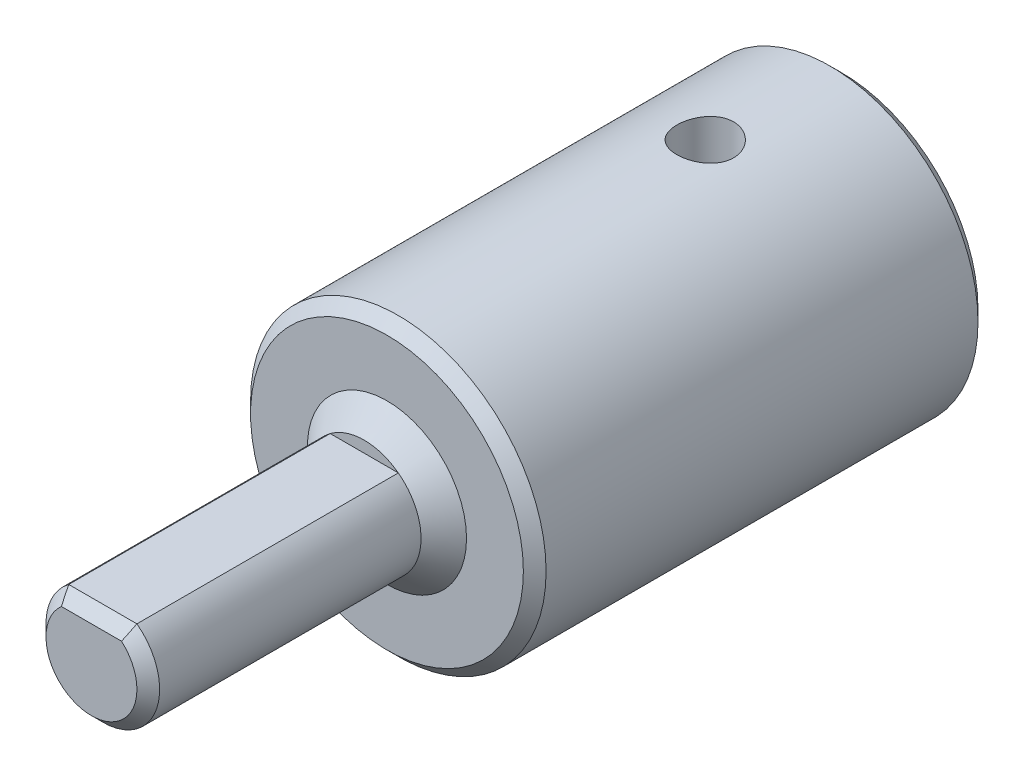
ISO-10303-21;
HEADER;
FILE_DESCRIPTION(('STEP AP214'),'2;1');
FILE_NAME('part.step','',(''),(''),'','','');
FILE_SCHEMA(('AUTOMOTIVE_DESIGN { 1 0 10303 214 1 1 1 1 }'));
ENDSEC;
DATA;
#1=APPLICATION_CONTEXT('core data for automotive mechanical design processes');
#2=APPLICATION_PROTOCOL_DEFINITION('international standard','automotive_design',2000,#1);
#3=PRODUCT_CONTEXT('',#1,'mechanical');
#4=PRODUCT('Part','Part','',(#3));
#5=PRODUCT_RELATED_PRODUCT_CATEGORY('part','',(#4));
#6=PRODUCT_DEFINITION_FORMATION('','',#4);
#7=PRODUCT_DEFINITION_CONTEXT('part definition',#1,'design');
#8=PRODUCT_DEFINITION('design','',#6,#7);
#9=PRODUCT_DEFINITION_SHAPE('','',#8);
#10=(LENGTH_UNIT() NAMED_UNIT(*) SI_UNIT(.MILLI.,.METRE.));
#11=(NAMED_UNIT(*) PLANE_ANGLE_UNIT() SI_UNIT($,.RADIAN.));
#12=(NAMED_UNIT(*) SI_UNIT($,.STERADIAN.) SOLID_ANGLE_UNIT());
#13=UNCERTAINTY_MEASURE_WITH_UNIT(LENGTH_MEASURE(1.E-05),#10,'distance_accuracy_value','');
#14=(GEOMETRIC_REPRESENTATION_CONTEXT(3) GLOBAL_UNCERTAINTY_ASSIGNED_CONTEXT((#13)) GLOBAL_UNIT_ASSIGNED_CONTEXT((#10,
#11,#12)) REPRESENTATION_CONTEXT('',''));
#15=CARTESIAN_POINT('',(0.,0.,0.));
#16=DIRECTION('',(0.,0.,1.));
#17=DIRECTION('',(1.,0.,0.));
#18=AXIS2_PLACEMENT_3D('',#15,#16,#17);
#19=CARTESIAN_POINT('',(0.,0.,20.));
#20=DIRECTION('',(0.,0.,-1.));
#21=DIRECTION('',(-1.,0.,0.));
#22=AXIS2_PLACEMENT_3D('',#19,#20,#21);
#23=CYLINDRICAL_SURFACE('',#22,6.5);
#24=CARTESIAN_POINT('',(0.,0.,0.500000000000011));
#25=DIRECTION('',(0.,0.,1.));
#26=DIRECTION('',(1.,0.,0.));
#27=AXIS2_PLACEMENT_3D('',#24,#25,#26);
#28=CIRCLE('',#27,6.5);
#29=CARTESIAN_POINT('',(6.5,0.,0.500000000000011));
#30=VERTEX_POINT('',#29);
#31=EDGE_CURVE('E48',#30,#30,#28,.T.);
#32=ORIENTED_EDGE('',*,*,#31,.T.);
#33=EDGE_LOOP('',(#32));
#34=FACE_BOUND('',#33,.T.);
#35=CARTESIAN_POINT('',(0.,0.,19.5));
#36=DIRECTION('',(0.,0.,1.));
#37=DIRECTION('',(1.,0.,0.));
#38=AXIS2_PLACEMENT_3D('',#35,#36,#37);
#39=CIRCLE('',#38,6.5);
#40=CARTESIAN_POINT('',(6.5,0.,19.5));
#41=VERTEX_POINT('',#40);
#42=EDGE_CURVE('E266',#41,#41,#39,.F.);
#43=ORIENTED_EDGE('',*,*,#42,.T.);
#44=EDGE_LOOP('',(#43));
#45=FACE_BOUND('',#44,.T.);
#46=CARTESIAN_POINT('',(0.,6.5,4.75));
#47=CARTESIAN_POINT('',(-0.0695263300903769,6.49999873054918,4.75000262060985));
#48=CARTESIAN_POINT('',(-0.139086386536078,6.49887299034978,4.755820293649));
#49=CARTESIAN_POINT('',(-0.27624406654568,6.49449072478032,4.77892097243111));
#50=CARTESIAN_POINT('',(-0.3438400224473,6.49123244093525,4.79621344034301));
#51=CARTESIAN_POINT('',(-0.475066268731186,6.48294932466697,4.84171279024407));
#52=CARTESIAN_POINT('',(-0.538700159856868,6.47792612463065,4.86990958913682));
#53=CARTESIAN_POINT('',(-0.660328619211793,6.46666077439192,4.93638806396313));
#54=CARTESIAN_POINT('',(-0.718323597744222,6.46041871297687,4.97466900539309));
#55=CARTESIAN_POINT('',(-0.82776216487111,6.44731615012176,5.06073958285389));
#56=CARTESIAN_POINT('',(-0.87912464768377,6.44044947743084,5.10863141572555));
#57=CARTESIAN_POINT('',(-0.973138343078083,6.42691706808667,5.21234451859733));
#58=CARTESIAN_POINT('',(-1.01578890972676,6.42025134636388,5.26816637603829));
#59=CARTESIAN_POINT('',(-1.09150839810311,6.4078154700976,5.3867319976789));
#60=CARTESIAN_POINT('',(-1.12449425725113,6.40205326632547,5.44952971555017));
#61=CARTESIAN_POINT('',(-1.17941610157594,6.39216406280365,5.57990495501328));
#62=CARTESIAN_POINT('',(-1.20135309167639,6.38803691434868,5.64748204127121));
#63=CARTESIAN_POINT('',(-1.23329305228569,6.38194735063818,5.78462809585959));
#64=CARTESIAN_POINT('',(-1.24343779395771,6.37995924110286,5.85416288334854));
#65=CARTESIAN_POINT('',(-1.2519454509238,6.37829543879724,5.99397381845999));
#66=CARTESIAN_POINT('',(-1.25030947843596,6.3786195277321,6.06424989547179));
#67=CARTESIAN_POINT('',(-1.23541697804277,6.38152012920898,6.20251761158104));
#68=CARTESIAN_POINT('',(-1.22232215325027,6.38406529733108,6.27052742238238));
#69=CARTESIAN_POINT('',(-1.18513854067889,6.39107200195106,6.40336649155779));
#70=CARTESIAN_POINT('',(-1.16104926380166,6.39553362370363,6.46819560829363));
#71=CARTESIAN_POINT('',(-1.10240382729656,6.40590301761788,6.59330347190975));
#72=CARTESIAN_POINT('',(-1.06778282798614,6.41181970353635,6.653551055254));
#73=CARTESIAN_POINT('',(-0.989102525446738,6.42442673553149,6.76744248556929));
#74=CARTESIAN_POINT('',(-0.945042216343233,6.43111716402495,6.82108562779584));
#75=CARTESIAN_POINT('',(-0.847864455663339,6.44465411904849,6.92117926711041));
#76=CARTESIAN_POINT('',(-0.794608805779965,6.45150139326972,6.9674955950184));
#77=CARTESIAN_POINT('',(-0.681013328076993,6.46447860514488,7.05055775365026));
#78=CARTESIAN_POINT('',(-0.620673422062239,6.47060853487937,7.08730347872057));
#79=CARTESIAN_POINT('',(-0.494478881244397,6.48147374305158,7.15020302351983));
#80=CARTESIAN_POINT('',(-0.428616856521534,6.48620711303174,7.17634236730858));
#81=CARTESIAN_POINT('',(-0.293325284598558,6.49373123608211,7.21714871167345));
#82=CARTESIAN_POINT('',(-0.223896137321169,6.4965222064135,7.2318169953326));
#83=CARTESIAN_POINT('',(-0.0845949575723083,6.4998170641524,7.24907688307679));
#84=CARTESIAN_POINT('',(-0.0147464889976595,6.50035574677272,7.25185223592052));
#85=CARTESIAN_POINT('',(0.124416318296412,6.49918164994221,7.24574111140168));
#86=CARTESIAN_POINT('',(0.193730684493375,6.497468987103,7.23685523804883));
#87=CARTESIAN_POINT('',(0.329271121290111,6.49200634359787,7.20782662800249));
#88=CARTESIAN_POINT('',(0.395517951862497,6.48827328656802,7.18777736078712));
#89=CARTESIAN_POINT('',(0.523709778000948,6.47918677244289,7.13709260993778));
#90=CARTESIAN_POINT('',(0.58565446945985,6.47383320094063,7.10645637885136));
#91=CARTESIAN_POINT('',(0.704264341336228,6.4620127326735,7.03506412841263));
#92=CARTESIAN_POINT('',(0.760861092631656,6.4555338112679,6.9941964542316));
#93=CARTESIAN_POINT('',(0.866459302715516,6.44221127589378,6.90365188825132));
#94=CARTESIAN_POINT('',(0.915460011904465,6.43536762602225,6.85397412808302));
#95=CARTESIAN_POINT('',(1.00517755082431,6.42197081919612,6.74638591930198));
#96=CARTESIAN_POINT('',(1.04576869619256,6.41542307578637,6.68836987485852));
#97=CARTESIAN_POINT('',(1.11662974416659,6.40347051879715,6.56623483786333));
#98=CARTESIAN_POINT('',(1.14690004216187,6.39806566143697,6.50211607922572));
#99=CARTESIAN_POINT('',(1.19608442093859,6.3890537865887,6.36990682052688));
#100=CARTESIAN_POINT('',(1.21505488797639,6.385437857926,6.30183793326623));
#101=CARTESIAN_POINT('',(1.24127395271723,6.38039343660705,6.16340246339675));
#102=CARTESIAN_POINT('',(1.24852394995944,6.37896468278173,6.0930361561463));
#103=CARTESIAN_POINT('',(1.25104755843674,6.37847010253234,5.95326332203922));
#104=CARTESIAN_POINT('',(1.24651955106104,6.37936513521924,5.88386043851629));
#105=CARTESIAN_POINT('',(1.22605133269021,6.38333023983079,5.7468250277468));
#106=CARTESIAN_POINT('',(1.21011119845593,6.38640029712568,5.67919248859562));
#107=CARTESIAN_POINT('',(1.1673567385875,6.39435266298136,5.54773169007899));
#108=CARTESIAN_POINT('',(1.14056497100194,6.39923121033494,5.48389585204118));
#109=CARTESIAN_POINT('',(1.07688985392764,6.4102533266987,5.36159381905454));
#110=CARTESIAN_POINT('',(1.04000574067459,6.41639699144119,5.30312803094554));
#111=CARTESIAN_POINT('',(0.956507819072144,6.42937795151368,5.19223421265769));
#112=CARTESIAN_POINT('',(0.909750049269229,6.43622463982555,5.13991565925893));
#113=CARTESIAN_POINT('',(0.808131192425045,6.44977101580728,5.04380131225285));
#114=CARTESIAN_POINT('',(0.753268246630375,6.45647066935191,5.00000747896595));
#115=CARTESIAN_POINT('',(0.636368128673317,6.46904328529454,4.92179349157222));
#116=CARTESIAN_POINT('',(0.57426746743471,6.47490774506217,4.88746681496543));
#117=CARTESIAN_POINT('',(0.445086129675208,6.48506595383496,4.82978960381797));
#118=CARTESIAN_POINT('',(0.378010126647429,6.48936115496814,4.80642891606555));
#119=CARTESIAN_POINT('',(0.258961782852773,6.49503671875109,4.77600770789271));
#120=CARTESIAN_POINT('',(0.207678719850838,6.49688729501668,4.76627175512383));
#121=CARTESIAN_POINT('',(0.104270079257342,6.49936939476943,4.75326700818148));
#122=CARTESIAN_POINT('',(0.0521445250851636,6.50000095208405,4.74999803455099));
#123=CARTESIAN_POINT('',(0.,6.5,4.75));
#124=B_SPLINE_CURVE_WITH_KNOTS('',3,(#46,#47,#48,#49,#50,#51,#52,#53,#54,#55,#56,#57,#58,#59,
#60,#61,#62,#63,#64,#65,#66,#67,#68,#69,#70,#71,#72,#73,#74,#75,#76,#77,#78,#79,#80,#81,#82,#83,
#84,#85,#86,#87,#88,#89,#90,#91,#92,#93,#94,#95,#96,#97,#98,#99,#100,#101,#102,#103,#104,#105,
#106,#107,#108,#109,#110,#111,#112,#113,#114,#115,#116,#117,#118,#119,#120,#121,#122,#123),
.UNSPECIFIED.,.T.,.F.,(4,2,2,2,2,2,2,2,2,2,2,2,2,2,2,2,2,2,2,2,2,2,2,2,2,2,2,2,2,2,2,2,2,2,2,2,
2,2,4),(0.,0.208388270286286,0.416948592398259,0.625316520786646,0.833669276372912,
1.0443676620205,1.25508166394262,1.46755680912121,1.68001262563574,1.88988689492414,
2.09974135022729,2.30668132349721,2.51363050358035,2.72188049935154,2.93015269776841,
3.14188196787827,3.35361357524978,3.56563319670022,3.77762909953165,3.98633752849765,
4.19503514754155,4.40201109247083,4.60900165313827,4.81835785477028,5.0277347031462,
5.24004512383251,5.45234741003696,5.66358123272488,5.87478983015679,6.08246408561773,
6.29013694422222,6.49738029642496,6.70463933664288,6.91515952159825,7.12572806013492,
7.33830680136692,7.55068832965364,7.70698320273414,7.8632737386113),.UNSPECIFIED.);
#125=CARTESIAN_POINT('',(0.,6.5,4.75));
#126=VERTEX_POINT('',#125);
#127=EDGE_CURVE('E200',#126,#126,#124,.T.);
#128=ORIENTED_EDGE('',*,*,#127,.F.);
#129=EDGE_LOOP('',(#128));
#130=FACE_BOUND('',#129,.T.);
#131=ADVANCED_FACE('F38',(#34,#45,#130),#23,.T.);
#132=CARTESIAN_POINT('',(0.,0.,20.));
#133=DIRECTION('',(0.,0.,1.));
#134=DIRECTION('',(1.,0.,0.));
#135=AXIS2_PLACEMENT_3D('',#132,#133,#134);
#136=PLANE('',#135);
#137=CARTESIAN_POINT('',(0.,0.,20.));
#138=DIRECTION('',(0.,0.,1.));
#139=DIRECTION('',(1.,0.,0.));
#140=AXIS2_PLACEMENT_3D('',#137,#138,#139);
#141=CIRCLE('',#140,6.);
#142=CARTESIAN_POINT('',(6.,0.,20.));
#143=VERTEX_POINT('',#142);
#144=EDGE_CURVE('E11',#143,#143,#141,.T.);
#145=ORIENTED_EDGE('',*,*,#144,.T.);
#146=EDGE_LOOP('',(#145));
#147=FACE_BOUND('',#146,.T.);
#148=CARTESIAN_POINT('',(0.,0.,20.));
#149=DIRECTION('',(0.,0.,1.));
#150=DIRECTION('',(1.,0.,0.));
#151=AXIS2_PLACEMENT_3D('',#148,#149,#150);
#152=CIRCLE('',#151,3.50000000000001);
#153=CARTESIAN_POINT('',(3.50000000000001,0.,20.));
#154=VERTEX_POINT('',#153);
#155=EDGE_CURVE('E138',#154,#154,#152,.F.);
#156=ORIENTED_EDGE('',*,*,#155,.T.);
#157=EDGE_LOOP('',(#156));
#158=FACE_BOUND('',#157,.T.);
#159=ADVANCED_FACE('F249',(#147,#158),#136,.T.);
#160=CARTESIAN_POINT('',(0.,0.,0.));
#161=DIRECTION('',(0.,0.,1.));
#162=DIRECTION('',(1.,0.,0.));
#163=AXIS2_PLACEMENT_3D('',#160,#161,#162);
#164=PLANE('',#163);
#165=CARTESIAN_POINT('',(0.,0.,0.));
#166=DIRECTION('',(0.,0.,1.));
#167=DIRECTION('',(1.,0.,0.));
#168=AXIS2_PLACEMENT_3D('',#165,#166,#167);
#169=CIRCLE('',#168,4.6);
#170=CARTESIAN_POINT('',(-3.3985290935939,3.09999999999932,0.));
#171=VERTEX_POINT('',#170);
#172=CARTESIAN_POINT('',(3.3985290935939,3.09999999999932,0.));
#173=VERTEX_POINT('',#172);
#174=EDGE_CURVE('E55',#171,#173,#169,.T.);
#175=ORIENTED_EDGE('',*,*,#174,.T.);
#176=DIRECTION('',(-1.,0.,0.));
#177=VECTOR('',#176,1.);
#178=CARTESIAN_POINT('',(0.,3.09999999999999,0.));
#179=LINE('',#178,#177);
#180=EDGE_CURVE('E271',#173,#171,#179,.T.);
#181=ORIENTED_EDGE('',*,*,#180,.T.);
#182=EDGE_LOOP('',(#175,#181));
#183=FACE_BOUND('',#182,.T.);
#184=CARTESIAN_POINT('',(0.,0.,0.));
#185=DIRECTION('',(0.,0.,1.));
#186=DIRECTION('',(1.,0.,0.));
#187=AXIS2_PLACEMENT_3D('',#184,#185,#186);
#188=CIRCLE('',#187,5.99999999999999);
#189=CARTESIAN_POINT('',(5.99999999999999,0.,0.));
#190=VERTEX_POINT('',#189);
#191=EDGE_CURVE('E278',#190,#190,#188,.F.);
#192=ORIENTED_EDGE('',*,*,#191,.T.);
#193=EDGE_LOOP('',(#192));
#194=FACE_BOUND('',#193,.T.);
#195=ADVANCED_FACE('F245',(#183,#194),#164,.F.);
#196=CARTESIAN_POINT('',(0.,0.,33.));
#197=DIRECTION('',(0.,0.,-1.));
#198=DIRECTION('',(-1.,0.,0.));
#199=AXIS2_PLACEMENT_3D('',#196,#197,#198);
#200=CYLINDRICAL_SURFACE('',#199,2.5);
#201=DIRECTION('',(0.,0.,1.));
#202=VECTOR('',#201,1.);
#203=CARTESIAN_POINT('',(1.5,2.,21.));
#204=LINE('',#203,#202);
#205=CARTESIAN_POINT('',(1.5,2.,21.));
#206=VERTEX_POINT('',#205);
#207=CARTESIAN_POINT('',(1.5,2.,32.5));
#208=VERTEX_POINT('',#207);
#209=EDGE_CURVE('E129',#206,#208,#204,.T.);
#210=ORIENTED_EDGE('',*,*,#209,.T.);
#211=CARTESIAN_POINT('',(0.,0.,32.5));
#212=DIRECTION('',(0.,0.,1.));
#213=DIRECTION('',(1.,0.,0.));
#214=AXIS2_PLACEMENT_3D('',#211,#212,#213);
#215=CIRCLE('',#214,2.5);
#216=CARTESIAN_POINT('',(-1.5,2.,32.5));
#217=VERTEX_POINT('',#216);
#218=EDGE_CURVE('E152',#208,#217,#215,.F.);
#219=ORIENTED_EDGE('',*,*,#218,.T.);
#220=DIRECTION('',(0.,0.,1.));
#221=VECTOR('',#220,1.);
#222=CARTESIAN_POINT('',(-1.5,2.,21.));
#223=LINE('',#222,#221);
#224=CARTESIAN_POINT('',(-1.5,2.,21.));
#225=VERTEX_POINT('',#224);
#226=EDGE_CURVE('E128',#225,#217,#223,.T.);
#227=ORIENTED_EDGE('',*,*,#226,.F.);
#228=CARTESIAN_POINT('',(0.,0.,21.));
#229=DIRECTION('',(0.,0.,1.));
#230=DIRECTION('',(1.,0.,0.));
#231=AXIS2_PLACEMENT_3D('',#228,#229,#230);
#232=CIRCLE('',#231,2.5);
#233=EDGE_CURVE('E133',#225,#206,#232,.T.);
#234=ORIENTED_EDGE('',*,*,#233,.T.);
#235=EDGE_LOOP('',(#210,#219,#227,#234));
#236=FACE_BOUND('',#235,.T.);
#237=ADVANCED_FACE('F241',(#236),#200,.T.);
#238=CARTESIAN_POINT('',(0.,0.,33.));
#239=DIRECTION('',(0.,0.,1.));
#240=DIRECTION('',(1.,0.,0.));
#241=AXIS2_PLACEMENT_3D('',#238,#239,#240);
#242=PLANE('',#241);
#243=CARTESIAN_POINT('',(0.,0.,33.));
#244=DIRECTION('',(0.,0.,1.));
#245=DIRECTION('',(1.,0.,0.));
#246=AXIS2_PLACEMENT_3D('',#243,#244,#245);
#247=CIRCLE('',#246,2.00000000000003);
#248=CARTESIAN_POINT('',(-1.32287565553231,1.50000000000003,33.));
#249=VERTEX_POINT('',#248);
#250=CARTESIAN_POINT('',(1.32287565553231,1.50000000000003,33.));
#251=VERTEX_POINT('',#250);
#252=EDGE_CURVE('E146',#249,#251,#247,.T.);
#253=ORIENTED_EDGE('',*,*,#252,.T.);
#254=DIRECTION('',(-1.,0.,0.));
#255=VECTOR('',#254,1.);
#256=CARTESIAN_POINT('',(-1.5,1.50000000000003,33.));
#257=LINE('',#256,#255);
#258=EDGE_CURVE('E148',#251,#249,#257,.T.);
#259=ORIENTED_EDGE('',*,*,#258,.T.);
#260=EDGE_LOOP('',(#253,#259));
#261=FACE_BOUND('',#260,.T.);
#262=ADVANCED_FACE('F237',(#261),#242,.T.);
#263=CARTESIAN_POINT('',(0.,2.,21.));
#264=DIRECTION('',(0.,-1.,0.));
#265=DIRECTION('',(0.,0.,-1.));
#266=AXIS2_PLACEMENT_3D('',#263,#264,#265);
#267=PLANE('',#266);
#268=ORIENTED_EDGE('',*,*,#226,.T.);
#269=DIRECTION('',(1.,0.,0.));
#270=VECTOR('',#269,1.);
#271=CARTESIAN_POINT('',(1.5,2.,32.5));
#272=LINE('',#271,#270);
#273=EDGE_CURVE('E142',#217,#208,#272,.T.);
#274=ORIENTED_EDGE('',*,*,#273,.T.);
#275=ORIENTED_EDGE('',*,*,#209,.F.);
#276=DIRECTION('',(1.,0.,0.));
#277=VECTOR('',#276,1.);
#278=CARTESIAN_POINT('',(0.,2.,21.));
#279=LINE('',#278,#277);
#280=EDGE_CURVE('E121',#225,#206,#279,.T.);
#281=ORIENTED_EDGE('',*,*,#280,.F.);
#282=EDGE_LOOP('',(#268,#274,#275,#281));
#283=FACE_BOUND('',#282,.T.);
#284=ADVANCED_FACE('F233',(#283),#267,.F.);
#285=CARTESIAN_POINT('',(0.,0.,21.));
#286=DIRECTION('',(0.,0.,1.));
#287=DIRECTION('',(1.,0.,0.));
#288=AXIS2_PLACEMENT_3D('',#285,#286,#287);
#289=PLANE('',#288);
#290=CARTESIAN_POINT('',(0.,0.,21.));
#291=DIRECTION('',(0.,0.,1.));
#292=DIRECTION('',(1.,0.,0.));
#293=AXIS2_PLACEMENT_3D('',#290,#291,#292);
#294=CIRCLE('',#293,2.5);
#295=EDGE_CURVE('E115',#206,#225,#294,.T.);
#296=ORIENTED_EDGE('',*,*,#295,.T.);
#297=ORIENTED_EDGE('',*,*,#280,.T.);
#298=EDGE_LOOP('',(#296,#297));
#299=FACE_BOUND('',#298,.T.);
#300=ADVANCED_FACE('F230',(#299),#289,.T.);
#301=CARTESIAN_POINT('',(0.,0.,21.));
#302=DIRECTION('',(0.,0.,-1.));
#303=DIRECTION('',(-1.,0.,0.));
#304=AXIS2_PLACEMENT_3D('',#301,#302,#303);
#305=CONICAL_SURFACE('',#304,2.5,0.785398163397442);
#306=ORIENTED_EDGE('',*,*,#155,.F.);
#307=EDGE_LOOP('',(#306));
#308=FACE_BOUND('',#307,.T.);
#309=ORIENTED_EDGE('',*,*,#233,.F.);
#310=ORIENTED_EDGE('',*,*,#295,.F.);
#311=EDGE_LOOP('',(#309,#310));
#312=FACE_BOUND('',#311,.T.);
#313=ADVANCED_FACE('F229',(#308,#312),#305,.T.);
#314=CARTESIAN_POINT('',(0.,0.,27.589145385724));
#315=DIRECTION('',(0.,0.,-1.));
#316=DIRECTION('',(-1.,0.,0.));
#317=AXIS2_PLACEMENT_3D('',#314,#315,#316);
#318=CYLINDRICAL_SURFACE('',#317,4.1);
#319=DIRECTION('',(0.,0.,-1.));
#320=VECTOR('',#319,1.);
#321=CARTESIAN_POINT('',(3.17017349682947,2.6,27.589145385724));
#322=LINE('',#321,#320);
#323=CARTESIAN_POINT('',(3.17017349682947,2.6,17.));
#324=VERTEX_POINT('',#323);
#325=CARTESIAN_POINT('',(3.17017349682947,2.6,0.5));
#326=VERTEX_POINT('',#325);
#327=EDGE_CURVE('E99',#324,#326,#322,.T.);
#328=ORIENTED_EDGE('',*,*,#327,.T.);
#329=CARTESIAN_POINT('',(0.,0.,0.5));
#330=DIRECTION('',(0.,0.,1.));
#331=DIRECTION('',(1.,0.,0.));
#332=AXIS2_PLACEMENT_3D('',#329,#330,#331);
#333=CIRCLE('',#332,4.1);
#334=CARTESIAN_POINT('',(-3.17017349682947,2.6,0.5));
#335=VERTEX_POINT('',#334);
#336=EDGE_CURVE('E268',#326,#335,#333,.F.);
#337=ORIENTED_EDGE('',*,*,#336,.T.);
#338=DIRECTION('',(0.,0.,-1.));
#339=VECTOR('',#338,1.);
#340=CARTESIAN_POINT('',(-3.17017349682947,2.6,27.589145385724));
#341=LINE('',#340,#339);
#342=CARTESIAN_POINT('',(-3.17017349682947,2.6,17.));
#343=VERTEX_POINT('',#342);
#344=EDGE_CURVE('E101',#343,#335,#341,.T.);
#345=ORIENTED_EDGE('',*,*,#344,.F.);
#346=CARTESIAN_POINT('',(0.,0.,17.));
#347=DIRECTION('',(0.,0.,-1.));
#348=DIRECTION('',(-1.,0.,0.));
#349=AXIS2_PLACEMENT_3D('',#346,#347,#348);
#350=CIRCLE('',#349,4.1);
#351=EDGE_CURVE('E96',#343,#324,#350,.F.);
#352=ORIENTED_EDGE('',*,*,#351,.T.);
#353=EDGE_LOOP('',(#328,#337,#345,#352));
#354=FACE_BOUND('',#353,.T.);
#355=ADVANCED_FACE('F98',(#354),#318,.F.);
#356=CARTESIAN_POINT('',(-3.17017349682947,2.6,27.589145385724));
#357=DIRECTION('',(0.,1.,0.));
#358=DIRECTION('',(0.,0.,1.));
#359=AXIS2_PLACEMENT_3D('',#356,#357,#358);
#360=PLANE('',#359);
#361=CARTESIAN_POINT('',(0.,2.6,6.));
#362=DIRECTION('',(0.,1.,0.));
#363=DIRECTION('',(0.,0.,1.));
#364=AXIS2_PLACEMENT_3D('',#361,#362,#363);
#365=CIRCLE('',#364,1.25);
#366=CARTESIAN_POINT('',(0.,2.6,7.25));
#367=VERTEX_POINT('',#366);
#368=EDGE_CURVE('E42',#367,#367,#365,.F.);
#369=ORIENTED_EDGE('',*,*,#368,.F.);
#370=EDGE_LOOP('',(#369));
#371=FACE_BOUND('',#370,.T.);
#372=ORIENTED_EDGE('',*,*,#344,.T.);
#373=DIRECTION('',(1.,0.,0.));
#374=VECTOR('',#373,1.);
#375=CARTESIAN_POINT('',(-3.17017349682947,2.6,0.5));
#376=LINE('',#375,#374);
#377=EDGE_CURVE('E110',#335,#326,#376,.T.);
#378=ORIENTED_EDGE('',*,*,#377,.T.);
#379=ORIENTED_EDGE('',*,*,#327,.F.);
#380=DIRECTION('',(-1.,0.,0.));
#381=VECTOR('',#380,1.);
#382=CARTESIAN_POINT('',(-3.17017349682947,2.6,17.));
#383=LINE('',#382,#381);
#384=EDGE_CURVE('E105',#324,#343,#383,.T.);
#385=ORIENTED_EDGE('',*,*,#384,.T.);
#386=EDGE_LOOP('',(#372,#378,#379,#385));
#387=FACE_BOUND('',#386,.T.);
#388=ADVANCED_FACE('F109',(#371,#387),#360,.F.);
#389=CARTESIAN_POINT('',(0.,0.,17.));
#390=DIRECTION('',(0.,0.,-1.));
#391=DIRECTION('',(-1.,0.,0.));
#392=AXIS2_PLACEMENT_3D('',#389,#390,#391);
#393=PLANE('',#392);
#394=ORIENTED_EDGE('',*,*,#351,.F.);
#395=ORIENTED_EDGE('',*,*,#384,.F.);
#396=EDGE_LOOP('',(#394,#395));
#397=FACE_BOUND('',#396,.T.);
#398=ADVANCED_FACE('F113',(#397),#393,.T.);
#399=CARTESIAN_POINT('',(0.,0.,33.));
#400=DIRECTION('',(0.,0.,-1.));
#401=DIRECTION('',(-1.,0.,0.));
#402=AXIS2_PLACEMENT_3D('',#399,#400,#401);
#403=CONICAL_SURFACE('',#402,2.00000000000003,0.785398163397447);
#404=CARTESIAN_POINT('',(1.5,2.,32.5));
#405=CARTESIAN_POINT('',(1.48606240845706,1.95818951891394,32.5418104810861));
#406=CARTESIAN_POINT('',(1.47194219050033,1.9164093079432,32.5835906920568));
#407=CARTESIAN_POINT('',(1.44330357435469,1.83291962185565,32.6670803781444));
#408=CARTESIAN_POINT('',(1.42878519796258,1.7912101429989,32.7087898570011));
#409=CARTESIAN_POINT('',(1.39931560745199,1.70786693978761,32.7921330602124));
#410=CARTESIAN_POINT('',(1.38436438703585,1.66623321654465,32.8337667834554));
#411=CARTESIAN_POINT('',(1.35398671696422,1.58305016231497,32.9169498376851));
#412=CARTESIAN_POINT('',(1.3385602413697,1.54150083606696,32.9584991639331));
#413=CARTESIAN_POINT('',(1.32287565553231,1.50000000000003,33.));
#414=B_SPLINE_CURVE_WITH_KNOTS('',3,(#404,#405,#406,#407,#408,#409,#410,#411,#412,#413),
.UNSPECIFIED.,.F.,.F.,(4,2,2,2,4),(0.,0.182248230989339,0.364486504817067,0.546727431451258,
0.728978322325537),.UNSPECIFIED.);
#415=EDGE_CURVE('E155',#251,#208,#414,.F.);
#416=ORIENTED_EDGE('',*,*,#415,.F.);
#417=ORIENTED_EDGE('',*,*,#252,.F.);
#418=CARTESIAN_POINT('',(-1.32287565553231,1.50000000000003,33.));
#419=CARTESIAN_POINT('',(-1.3385602413697,1.54150083606696,32.9584991639331));
#420=CARTESIAN_POINT('',(-1.35398671696422,1.58305016231497,32.9169498376851));
#421=CARTESIAN_POINT('',(-1.38436438703585,1.66623321654465,32.8337667834554));
#422=CARTESIAN_POINT('',(-1.39931560745199,1.70786693978761,32.7921330602124));
#423=CARTESIAN_POINT('',(-1.42878519796258,1.7912101429989,32.7087898570011));
#424=CARTESIAN_POINT('',(-1.44330357435469,1.83291962185565,32.6670803781444));
#425=CARTESIAN_POINT('',(-1.47194219050033,1.9164093079432,32.5835906920568));
#426=CARTESIAN_POINT('',(-1.48606240845706,1.95818951891394,32.5418104810861));
#427=CARTESIAN_POINT('',(-1.5,2.,32.5));
#428=B_SPLINE_CURVE_WITH_KNOTS('',3,(#418,#419,#420,#421,#422,#423,#424,#425,#426,#427),
.UNSPECIFIED.,.F.,.F.,(4,2,2,2,4),(0.,0.182250890874279,0.36449181750847,0.546730091336198,
0.728978322325536),.UNSPECIFIED.);
#429=EDGE_CURVE('E164',#217,#249,#428,.F.);
#430=ORIENTED_EDGE('',*,*,#429,.F.);
#431=ORIENTED_EDGE('',*,*,#218,.F.);
#432=EDGE_LOOP('',(#416,#417,#430,#431));
#433=FACE_BOUND('',#432,.T.);
#434=ADVANCED_FACE('F170',(#433),#403,.T.);
#435=CARTESIAN_POINT('',(0.,2.,32.5));
#436=DIRECTION('',(0.,0.707106781186549,0.707106781186546));
#437=DIRECTION('',(-1.,0.,0.));
#438=AXIS2_PLACEMENT_3D('',#435,#436,#437);
#439=PLANE('',#438);
#440=ORIENTED_EDGE('',*,*,#429,.T.);
#441=ORIENTED_EDGE('',*,*,#258,.F.);
#442=ORIENTED_EDGE('',*,*,#415,.T.);
#443=ORIENTED_EDGE('',*,*,#273,.F.);
#444=EDGE_LOOP('',(#440,#441,#442,#443));
#445=FACE_BOUND('',#444,.T.);
#446=ADVANCED_FACE('F173',(#445),#439,.T.);
#447=CARTESIAN_POINT('',(0.,0.,0.5));
#448=DIRECTION('',(0.,0.,-1.));
#449=DIRECTION('',(-1.,0.,0.));
#450=AXIS2_PLACEMENT_3D('',#447,#448,#449);
#451=CONICAL_SURFACE('',#450,4.1,0.785398163397443);
#452=CARTESIAN_POINT('',(3.17017349682947,2.6,0.5));
#453=CARTESIAN_POINT('',(3.20943066659172,2.68305992201102,0.41694007798898));
#454=CARTESIAN_POINT('',(3.24808891190886,2.76625661176758,0.333743388232413));
#455=CARTESIAN_POINT('',(3.32420744060555,2.93292327924683,0.16707672075317));
#456=CARTESIAN_POINT('',(3.36166772754305,3.01639325615702,0.0836067438429728));
#457=CARTESIAN_POINT('',(3.39852909359341,3.10000000000028,-2.90284727333738E-13));
#458=B_SPLINE_CURVE_WITH_KNOTS('',3,(#452,#453,#454,#455,#456,#457),.UNSPECIFIED.,.F.,.F.,(4,2,
4),(0.,0.371538079791444,0.743075056005057),.UNSPECIFIED.);
#459=EDGE_CURVE('E188',#173,#326,#458,.F.);
#460=ORIENTED_EDGE('',*,*,#459,.F.);
#461=ORIENTED_EDGE('',*,*,#174,.F.);
#462=CARTESIAN_POINT('',(-3.39852909359464,3.09999999999999,0.));
#463=CARTESIAN_POINT('',(-3.36166772754335,3.01639325615695,0.0836067438430474));
#464=CARTESIAN_POINT('',(-3.32420744060544,2.93292327924685,0.167076720753147));
#465=CARTESIAN_POINT('',(-3.24808891190897,2.76625661176757,0.333743388232432));
#466=CARTESIAN_POINT('',(-3.20943066659245,2.68305992201086,0.416940077989137));
#467=CARTESIAN_POINT('',(-3.17017349683135,2.59999999999959,0.500000000000414));
#468=B_SPLINE_CURVE_WITH_KNOTS('',3,(#462,#463,#464,#465,#466,#467),.UNSPECIFIED.,.F.,.F.,(4,2,
4),(0.,0.37153697621359,0.743075056005007),.UNSPECIFIED.);
#469=EDGE_CURVE('E62',#335,#171,#468,.F.);
#470=ORIENTED_EDGE('',*,*,#469,.F.);
#471=ORIENTED_EDGE('',*,*,#336,.F.);
#472=EDGE_LOOP('',(#460,#461,#470,#471));
#473=FACE_BOUND('',#472,.T.);
#474=ADVANCED_FACE('F177',(#473),#451,.F.);
#475=CARTESIAN_POINT('',(-3.17017349682947,2.6,0.5));
#476=DIRECTION('',(0.,0.707106781186551,0.707106781186544));
#477=DIRECTION('',(1.,0.,0.));
#478=AXIS2_PLACEMENT_3D('',#475,#476,#477);
#479=PLANE('',#478);
#480=ORIENTED_EDGE('',*,*,#469,.T.);
#481=ORIENTED_EDGE('',*,*,#180,.F.);
#482=ORIENTED_EDGE('',*,*,#459,.T.);
#483=ORIENTED_EDGE('',*,*,#377,.F.);
#484=EDGE_LOOP('',(#480,#481,#482,#483));
#485=FACE_BOUND('',#484,.T.);
#486=ADVANCED_FACE('F179',(#485),#479,.F.);
#487=CARTESIAN_POINT('',(0.,0.,0.500000000000011));
#488=DIRECTION('',(0.,0.,1.));
#489=DIRECTION('',(1.,0.,0.));
#490=AXIS2_PLACEMENT_3D('',#487,#488,#489);
#491=CONICAL_SURFACE('',#490,6.5,0.78539816339745);
#492=ORIENTED_EDGE('',*,*,#191,.F.);
#493=EDGE_LOOP('',(#492));
#494=FACE_BOUND('',#493,.T.);
#495=ORIENTED_EDGE('',*,*,#31,.F.);
#496=EDGE_LOOP('',(#495));
#497=FACE_BOUND('',#496,.T.);
#498=ADVANCED_FACE('F184',(#494,#497),#491,.T.);
#499=CARTESIAN_POINT('',(0.,0.,20.));
#500=DIRECTION('',(0.,0.,-1.));
#501=DIRECTION('',(-1.,0.,0.));
#502=AXIS2_PLACEMENT_3D('',#499,#500,#501);
#503=CONICAL_SURFACE('',#502,6.,0.78539816339745);
#504=ORIENTED_EDGE('',*,*,#42,.F.);
#505=EDGE_LOOP('',(#504));
#506=FACE_BOUND('',#505,.T.);
#507=ORIENTED_EDGE('',*,*,#144,.F.);
#508=EDGE_LOOP('',(#507));
#509=FACE_BOUND('',#508,.T.);
#510=ADVANCED_FACE('F40',(#506,#509),#503,.T.);
#511=CARTESIAN_POINT('',(0.,10.,6.));
#512=DIRECTION('',(0.,-1.,0.));
#513=DIRECTION('',(0.,0.,-1.));
#514=AXIS2_PLACEMENT_3D('',#511,#512,#513);
#515=CYLINDRICAL_SURFACE('',#514,1.25);
#516=ORIENTED_EDGE('',*,*,#368,.T.);
#517=EDGE_LOOP('',(#516));
#518=FACE_BOUND('',#517,.T.);
#519=ORIENTED_EDGE('',*,*,#127,.T.);
#520=EDGE_LOOP('',(#519));
#521=FACE_BOUND('',#520,.T.);
#522=ADVANCED_FACE('F219',(#518,#521),#515,.F.);
#523=CLOSED_SHELL('',(#131,#159,#195,#237,#262,#284,#300,#313,#355,#388,#398,#434,#446,#474,
#486,#498,#510,#522));
#524=MANIFOLD_SOLID_BREP('B2',#523);
#525=ADVANCED_BREP_SHAPE_REPRESENTATION('',(#18,#524),#14);
#526=SHAPE_DEFINITION_REPRESENTATION(#9,#525);
ENDSEC;
END-ISO-10303-21;
